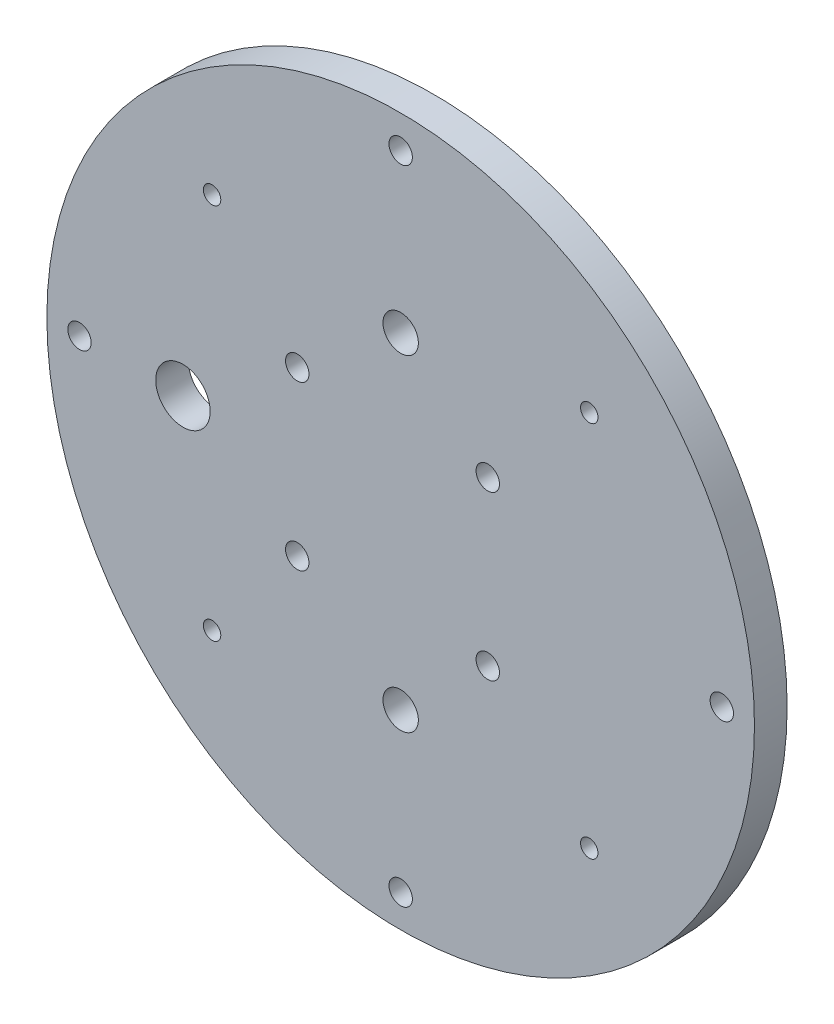
ISO-10303-21;
HEADER;
FILE_DESCRIPTION(('STEP AP214'),'2;1');
FILE_NAME('part.step','',(''),(''),'','','');
FILE_SCHEMA(('AUTOMOTIVE_DESIGN { 1 0 10303 214 1 1 1 1 }'));
ENDSEC;
DATA;
#1=APPLICATION_CONTEXT('core data for automotive mechanical design processes');
#2=APPLICATION_PROTOCOL_DEFINITION('international standard','automotive_design',2000,#1);
#3=PRODUCT_CONTEXT('',#1,'mechanical');
#4=PRODUCT('Part','Part','',(#3));
#5=PRODUCT_RELATED_PRODUCT_CATEGORY('part','',(#4));
#6=PRODUCT_DEFINITION_FORMATION('','',#4);
#7=PRODUCT_DEFINITION_CONTEXT('part definition',#1,'design');
#8=PRODUCT_DEFINITION('design','',#6,#7);
#9=PRODUCT_DEFINITION_SHAPE('','',#8);
#10=(LENGTH_UNIT() NAMED_UNIT(*) SI_UNIT(.MILLI.,.METRE.));
#11=(NAMED_UNIT(*) PLANE_ANGLE_UNIT() SI_UNIT($,.RADIAN.));
#12=(NAMED_UNIT(*) SI_UNIT($,.STERADIAN.) SOLID_ANGLE_UNIT());
#13=UNCERTAINTY_MEASURE_WITH_UNIT(LENGTH_MEASURE(1.E-05),#10,'distance_accuracy_value','');
#14=(GEOMETRIC_REPRESENTATION_CONTEXT(3) GLOBAL_UNCERTAINTY_ASSIGNED_CONTEXT((#13)) GLOBAL_UNIT_ASSIGNED_CONTEXT((#10,
#11,#12)) REPRESENTATION_CONTEXT('',''));
#15=CARTESIAN_POINT('',(0.,0.,0.));
#16=DIRECTION('',(0.,0.,1.));
#17=DIRECTION('',(1.,0.,0.));
#18=AXIS2_PLACEMENT_3D('',#15,#16,#17);
#19=CARTESIAN_POINT('',(0.,0.,6.));
#20=DIRECTION('',(0.,0.,1.));
#21=DIRECTION('',(1.,0.,0.));
#22=AXIS2_PLACEMENT_3D('',#19,#20,#21);
#23=PLANE('',#22);
#24=CARTESIAN_POINT('',(0.,-30.,6.));
#25=DIRECTION('',(0.,0.,1.));
#26=DIRECTION('',(1.,0.,0.));
#27=AXIS2_PLACEMENT_3D('',#24,#25,#26);
#28=CIRCLE('',#27,3.25);
#29=CARTESIAN_POINT('',(3.25,-30.,6.));
#30=VERTEX_POINT('',#29);
#31=EDGE_CURVE('E123',#30,#30,#28,.T.);
#32=ORIENTED_EDGE('',*,*,#31,.F.);
#33=EDGE_LOOP('',(#32));
#34=FACE_BOUND('',#33,.T.);
#35=CARTESIAN_POINT('',(16.,-15.,6.));
#36=DIRECTION('',(0.,0.,1.));
#37=DIRECTION('',(1.,0.,0.));
#38=AXIS2_PLACEMENT_3D('',#35,#36,#37);
#39=CIRCLE('',#38,2.15);
#40=CARTESIAN_POINT('',(18.15,-15.,6.));
#41=VERTEX_POINT('',#40);
#42=EDGE_CURVE('E111',#41,#41,#39,.T.);
#43=ORIENTED_EDGE('',*,*,#42,.F.);
#44=EDGE_LOOP('',(#43));
#45=FACE_BOUND('',#44,.T.);
#46=CARTESIAN_POINT('',(-19.,-15.,6.));
#47=DIRECTION('',(0.,0.,1.));
#48=DIRECTION('',(1.,0.,0.));
#49=AXIS2_PLACEMENT_3D('',#46,#47,#48);
#50=CIRCLE('',#49,2.15);
#51=CARTESIAN_POINT('',(-16.85,-15.,6.));
#52=VERTEX_POINT('',#51);
#53=EDGE_CURVE('E99',#52,#52,#50,.T.);
#54=ORIENTED_EDGE('',*,*,#53,.F.);
#55=EDGE_LOOP('',(#54));
#56=FACE_BOUND('',#55,.T.);
#57=CARTESIAN_POINT('',(0.,-59.,6.));
#58=DIRECTION('',(0.,0.,1.));
#59=DIRECTION('',(1.,0.,0.));
#60=AXIS2_PLACEMENT_3D('',#57,#58,#59);
#61=CIRCLE('',#60,2.15);
#62=CARTESIAN_POINT('',(2.14999999999999,-59.,6.));
#63=VERTEX_POINT('',#62);
#64=EDGE_CURVE('E87',#63,#63,#61,.T.);
#65=ORIENTED_EDGE('',*,*,#64,.F.);
#66=EDGE_LOOP('',(#65));
#67=FACE_BOUND('',#66,.T.);
#68=CARTESIAN_POINT('',(0.,59.,6.));
#69=DIRECTION('',(0.,0.,1.));
#70=DIRECTION('',(1.,0.,0.));
#71=AXIS2_PLACEMENT_3D('',#68,#69,#70);
#72=CIRCLE('',#71,2.15);
#73=CARTESIAN_POINT('',(2.15,59.,6.));
#74=VERTEX_POINT('',#73);
#75=EDGE_CURVE('E75',#74,#74,#72,.T.);
#76=ORIENTED_EDGE('',*,*,#75,.F.);
#77=EDGE_LOOP('',(#76));
#78=FACE_BOUND('',#77,.T.);
#79=CARTESIAN_POINT('',(34.6482322781408,-34.6482322781408,6.));
#80=DIRECTION('',(0.,0.,1.));
#81=DIRECTION('',(1.,0.,0.));
#82=AXIS2_PLACEMENT_3D('',#79,#80,#81);
#83=CIRCLE('',#82,1.6);
#84=CARTESIAN_POINT('',(36.2482322781408,-34.6482322781408,6.));
#85=VERTEX_POINT('',#84);
#86=EDGE_CURVE('E63',#85,#85,#83,.T.);
#87=ORIENTED_EDGE('',*,*,#86,.F.);
#88=EDGE_LOOP('',(#87));
#89=FACE_BOUND('',#88,.T.);
#90=CARTESIAN_POINT('',(-34.6482322781408,34.6482322781408,6.));
#91=DIRECTION('',(0.,0.,1.));
#92=DIRECTION('',(1.,0.,0.));
#93=AXIS2_PLACEMENT_3D('',#90,#91,#92);
#94=CIRCLE('',#93,1.6);
#95=CARTESIAN_POINT('',(-33.0482322781408,34.6482322781408,6.));
#96=VERTEX_POINT('',#95);
#97=EDGE_CURVE('E51',#96,#96,#94,.T.);
#98=ORIENTED_EDGE('',*,*,#97,.F.);
#99=EDGE_LOOP('',(#98));
#100=FACE_BOUND('',#99,.T.);
#101=CARTESIAN_POINT('',(0.,0.,6.));
#102=DIRECTION('',(0.,0.,1.));
#103=DIRECTION('',(1.,0.,0.));
#104=AXIS2_PLACEMENT_3D('',#101,#102,#103);
#105=CIRCLE('',#104,65.);
#106=CARTESIAN_POINT('',(65.,0.,6.));
#107=VERTEX_POINT('',#106);
#108=EDGE_CURVE('E10',#107,#107,#105,.T.);
#109=ORIENTED_EDGE('',*,*,#108,.T.);
#110=EDGE_LOOP('',(#109));
#111=FACE_BOUND('',#110,.T.);
#112=CARTESIAN_POINT('',(34.6482322781408,34.6482322781408,6.));
#113=DIRECTION('',(0.,0.,1.));
#114=DIRECTION('',(1.,0.,0.));
#115=AXIS2_PLACEMENT_3D('',#112,#113,#114);
#116=CIRCLE('',#115,1.6);
#117=CARTESIAN_POINT('',(36.2482322781408,34.6482322781408,6.));
#118=VERTEX_POINT('',#117);
#119=EDGE_CURVE('E46',#118,#118,#116,.T.);
#120=ORIENTED_EDGE('',*,*,#119,.F.);
#121=EDGE_LOOP('',(#120));
#122=FACE_BOUND('',#121,.T.);
#123=CARTESIAN_POINT('',(-34.6482322781408,-34.6482322781408,6.));
#124=DIRECTION('',(0.,0.,1.));
#125=DIRECTION('',(1.,0.,0.));
#126=AXIS2_PLACEMENT_3D('',#123,#124,#125);
#127=CIRCLE('',#126,1.6);
#128=CARTESIAN_POINT('',(-33.0482322781408,-34.6482322781408,6.));
#129=VERTEX_POINT('',#128);
#130=EDGE_CURVE('E57',#129,#129,#127,.T.);
#131=ORIENTED_EDGE('',*,*,#130,.F.);
#132=EDGE_LOOP('',(#131));
#133=FACE_BOUND('',#132,.T.);
#134=CARTESIAN_POINT('',(59.,0.,6.));
#135=DIRECTION('',(0.,0.,1.));
#136=DIRECTION('',(1.,0.,0.));
#137=AXIS2_PLACEMENT_3D('',#134,#135,#136);
#138=CIRCLE('',#137,2.15);
#139=CARTESIAN_POINT('',(61.15,0.,6.));
#140=VERTEX_POINT('',#139);
#141=EDGE_CURVE('E69',#140,#140,#138,.T.);
#142=ORIENTED_EDGE('',*,*,#141,.F.);
#143=EDGE_LOOP('',(#142));
#144=FACE_BOUND('',#143,.T.);
#145=CARTESIAN_POINT('',(-59.,0.,6.));
#146=DIRECTION('',(0.,0.,1.));
#147=DIRECTION('',(1.,0.,0.));
#148=AXIS2_PLACEMENT_3D('',#145,#146,#147);
#149=CIRCLE('',#148,2.15);
#150=CARTESIAN_POINT('',(-56.85,0.,6.));
#151=VERTEX_POINT('',#150);
#152=EDGE_CURVE('E81',#151,#151,#149,.T.);
#153=ORIENTED_EDGE('',*,*,#152,.F.);
#154=EDGE_LOOP('',(#153));
#155=FACE_BOUND('',#154,.T.);
#156=CARTESIAN_POINT('',(-19.,15.,6.));
#157=DIRECTION('',(0.,0.,1.));
#158=DIRECTION('',(1.,0.,0.));
#159=AXIS2_PLACEMENT_3D('',#156,#157,#158);
#160=CIRCLE('',#159,2.15);
#161=CARTESIAN_POINT('',(-16.85,15.,6.));
#162=VERTEX_POINT('',#161);
#163=EDGE_CURVE('E93',#162,#162,#160,.T.);
#164=ORIENTED_EDGE('',*,*,#163,.F.);
#165=EDGE_LOOP('',(#164));
#166=FACE_BOUND('',#165,.T.);
#167=CARTESIAN_POINT('',(16.,15.,6.));
#168=DIRECTION('',(0.,0.,1.));
#169=DIRECTION('',(1.,0.,0.));
#170=AXIS2_PLACEMENT_3D('',#167,#168,#169);
#171=CIRCLE('',#170,2.15);
#172=CARTESIAN_POINT('',(18.15,15.,6.));
#173=VERTEX_POINT('',#172);
#174=EDGE_CURVE('E105',#173,#173,#171,.T.);
#175=ORIENTED_EDGE('',*,*,#174,.F.);
#176=EDGE_LOOP('',(#175));
#177=FACE_BOUND('',#176,.T.);
#178=CARTESIAN_POINT('',(0.,30.,6.));
#179=DIRECTION('',(0.,0.,1.));
#180=DIRECTION('',(1.,0.,0.));
#181=AXIS2_PLACEMENT_3D('',#178,#179,#180);
#182=CIRCLE('',#181,3.25);
#183=CARTESIAN_POINT('',(3.25,30.,6.));
#184=VERTEX_POINT('',#183);
#185=EDGE_CURVE('E117',#184,#184,#182,.T.);
#186=ORIENTED_EDGE('',*,*,#185,.F.);
#187=EDGE_LOOP('',(#186));
#188=FACE_BOUND('',#187,.T.);
#189=CARTESIAN_POINT('',(-40.,0.,6.));
#190=DIRECTION('',(0.,0.,1.));
#191=DIRECTION('',(1.,0.,0.));
#192=AXIS2_PLACEMENT_3D('',#189,#190,#191);
#193=CIRCLE('',#192,5.);
#194=CARTESIAN_POINT('',(-35.,0.,6.));
#195=VERTEX_POINT('',#194);
#196=EDGE_CURVE('E129',#195,#195,#193,.T.);
#197=ORIENTED_EDGE('',*,*,#196,.F.);
#198=EDGE_LOOP('',(#197));
#199=FACE_BOUND('',#198,.T.);
#200=ADVANCED_FACE('F35',(#34,#45,#56,#67,#78,#89,#100,#111,#122,#133,#144,#155,#166,#177,#188,
#199),#23,.T.);
#201=CARTESIAN_POINT('',(0.,0.,0.));
#202=DIRECTION('',(0.,0.,1.));
#203=DIRECTION('',(1.,0.,0.));
#204=AXIS2_PLACEMENT_3D('',#201,#202,#203);
#205=PLANE('',#204);
#206=CARTESIAN_POINT('',(0.,0.,0.));
#207=DIRECTION('',(0.,0.,1.));
#208=DIRECTION('',(1.,0.,0.));
#209=AXIS2_PLACEMENT_3D('',#206,#207,#208);
#210=CIRCLE('',#209,65.);
#211=CARTESIAN_POINT('',(65.,0.,0.));
#212=VERTEX_POINT('',#211);
#213=EDGE_CURVE('E39',#212,#212,#210,.T.);
#214=ORIENTED_EDGE('',*,*,#213,.F.);
#215=EDGE_LOOP('',(#214));
#216=FACE_BOUND('',#215,.T.);
#217=CARTESIAN_POINT('',(34.6482322781408,34.6482322781408,0.));
#218=DIRECTION('',(0.,0.,1.));
#219=DIRECTION('',(1.,0.,0.));
#220=AXIS2_PLACEMENT_3D('',#217,#218,#219);
#221=CIRCLE('',#220,1.6);
#222=CARTESIAN_POINT('',(36.2482322781408,34.6482322781408,0.));
#223=VERTEX_POINT('',#222);
#224=EDGE_CURVE('E48',#223,#223,#221,.T.);
#225=ORIENTED_EDGE('',*,*,#224,.T.);
#226=EDGE_LOOP('',(#225));
#227=FACE_BOUND('',#226,.T.);
#228=CARTESIAN_POINT('',(-34.6482322781408,34.6482322781408,0.));
#229=DIRECTION('',(0.,0.,1.));
#230=DIRECTION('',(1.,0.,0.));
#231=AXIS2_PLACEMENT_3D('',#228,#229,#230);
#232=CIRCLE('',#231,1.6);
#233=CARTESIAN_POINT('',(-33.0482322781408,34.6482322781408,0.));
#234=VERTEX_POINT('',#233);
#235=EDGE_CURVE('E54',#234,#234,#232,.T.);
#236=ORIENTED_EDGE('',*,*,#235,.T.);
#237=EDGE_LOOP('',(#236));
#238=FACE_BOUND('',#237,.T.);
#239=CARTESIAN_POINT('',(-34.6482322781408,-34.6482322781408,0.));
#240=DIRECTION('',(0.,0.,1.));
#241=DIRECTION('',(1.,0.,0.));
#242=AXIS2_PLACEMENT_3D('',#239,#240,#241);
#243=CIRCLE('',#242,1.6);
#244=CARTESIAN_POINT('',(-33.0482322781408,-34.6482322781408,0.));
#245=VERTEX_POINT('',#244);
#246=EDGE_CURVE('E60',#245,#245,#243,.T.);
#247=ORIENTED_EDGE('',*,*,#246,.T.);
#248=EDGE_LOOP('',(#247));
#249=FACE_BOUND('',#248,.T.);
#250=CARTESIAN_POINT('',(34.6482322781408,-34.6482322781408,0.));
#251=DIRECTION('',(0.,0.,1.));
#252=DIRECTION('',(1.,0.,0.));
#253=AXIS2_PLACEMENT_3D('',#250,#251,#252);
#254=CIRCLE('',#253,1.6);
#255=CARTESIAN_POINT('',(36.2482322781408,-34.6482322781408,0.));
#256=VERTEX_POINT('',#255);
#257=EDGE_CURVE('E66',#256,#256,#254,.T.);
#258=ORIENTED_EDGE('',*,*,#257,.T.);
#259=EDGE_LOOP('',(#258));
#260=FACE_BOUND('',#259,.T.);
#261=CARTESIAN_POINT('',(59.,0.,0.));
#262=DIRECTION('',(0.,0.,1.));
#263=DIRECTION('',(1.,0.,0.));
#264=AXIS2_PLACEMENT_3D('',#261,#262,#263);
#265=CIRCLE('',#264,2.15);
#266=CARTESIAN_POINT('',(61.15,0.,0.));
#267=VERTEX_POINT('',#266);
#268=EDGE_CURVE('E72',#267,#267,#265,.T.);
#269=ORIENTED_EDGE('',*,*,#268,.T.);
#270=EDGE_LOOP('',(#269));
#271=FACE_BOUND('',#270,.T.);
#272=CARTESIAN_POINT('',(0.,59.,0.));
#273=DIRECTION('',(0.,0.,1.));
#274=DIRECTION('',(1.,0.,0.));
#275=AXIS2_PLACEMENT_3D('',#272,#273,#274);
#276=CIRCLE('',#275,2.15);
#277=CARTESIAN_POINT('',(2.15,59.,0.));
#278=VERTEX_POINT('',#277);
#279=EDGE_CURVE('E78',#278,#278,#276,.T.);
#280=ORIENTED_EDGE('',*,*,#279,.T.);
#281=EDGE_LOOP('',(#280));
#282=FACE_BOUND('',#281,.T.);
#283=CARTESIAN_POINT('',(-59.,0.,0.));
#284=DIRECTION('',(0.,0.,1.));
#285=DIRECTION('',(1.,0.,0.));
#286=AXIS2_PLACEMENT_3D('',#283,#284,#285);
#287=CIRCLE('',#286,2.15);
#288=CARTESIAN_POINT('',(-56.85,0.,0.));
#289=VERTEX_POINT('',#288);
#290=EDGE_CURVE('E84',#289,#289,#287,.T.);
#291=ORIENTED_EDGE('',*,*,#290,.T.);
#292=EDGE_LOOP('',(#291));
#293=FACE_BOUND('',#292,.T.);
#294=CARTESIAN_POINT('',(0.,-59.,0.));
#295=DIRECTION('',(0.,0.,1.));
#296=DIRECTION('',(1.,0.,0.));
#297=AXIS2_PLACEMENT_3D('',#294,#295,#296);
#298=CIRCLE('',#297,2.15);
#299=CARTESIAN_POINT('',(2.14999999999999,-59.,0.));
#300=VERTEX_POINT('',#299);
#301=EDGE_CURVE('E90',#300,#300,#298,.T.);
#302=ORIENTED_EDGE('',*,*,#301,.T.);
#303=EDGE_LOOP('',(#302));
#304=FACE_BOUND('',#303,.T.);
#305=CARTESIAN_POINT('',(-19.,15.,0.));
#306=DIRECTION('',(0.,0.,1.));
#307=DIRECTION('',(1.,0.,0.));
#308=AXIS2_PLACEMENT_3D('',#305,#306,#307);
#309=CIRCLE('',#308,2.15);
#310=CARTESIAN_POINT('',(-16.85,15.,0.));
#311=VERTEX_POINT('',#310);
#312=EDGE_CURVE('E96',#311,#311,#309,.T.);
#313=ORIENTED_EDGE('',*,*,#312,.T.);
#314=EDGE_LOOP('',(#313));
#315=FACE_BOUND('',#314,.T.);
#316=CARTESIAN_POINT('',(-19.,-15.,0.));
#317=DIRECTION('',(0.,0.,1.));
#318=DIRECTION('',(1.,0.,0.));
#319=AXIS2_PLACEMENT_3D('',#316,#317,#318);
#320=CIRCLE('',#319,2.15);
#321=CARTESIAN_POINT('',(-16.85,-15.,0.));
#322=VERTEX_POINT('',#321);
#323=EDGE_CURVE('E102',#322,#322,#320,.T.);
#324=ORIENTED_EDGE('',*,*,#323,.T.);
#325=EDGE_LOOP('',(#324));
#326=FACE_BOUND('',#325,.T.);
#327=CARTESIAN_POINT('',(16.,15.,0.));
#328=DIRECTION('',(0.,0.,1.));
#329=DIRECTION('',(1.,0.,0.));
#330=AXIS2_PLACEMENT_3D('',#327,#328,#329);
#331=CIRCLE('',#330,2.15);
#332=CARTESIAN_POINT('',(18.15,15.,0.));
#333=VERTEX_POINT('',#332);
#334=EDGE_CURVE('E108',#333,#333,#331,.T.);
#335=ORIENTED_EDGE('',*,*,#334,.T.);
#336=EDGE_LOOP('',(#335));
#337=FACE_BOUND('',#336,.T.);
#338=CARTESIAN_POINT('',(16.,-15.,0.));
#339=DIRECTION('',(0.,0.,1.));
#340=DIRECTION('',(1.,0.,0.));
#341=AXIS2_PLACEMENT_3D('',#338,#339,#340);
#342=CIRCLE('',#341,2.15);
#343=CARTESIAN_POINT('',(18.15,-15.,0.));
#344=VERTEX_POINT('',#343);
#345=EDGE_CURVE('E114',#344,#344,#342,.T.);
#346=ORIENTED_EDGE('',*,*,#345,.T.);
#347=EDGE_LOOP('',(#346));
#348=FACE_BOUND('',#347,.T.);
#349=CARTESIAN_POINT('',(0.,30.,0.));
#350=DIRECTION('',(0.,0.,1.));
#351=DIRECTION('',(1.,0.,0.));
#352=AXIS2_PLACEMENT_3D('',#349,#350,#351);
#353=CIRCLE('',#352,3.25);
#354=CARTESIAN_POINT('',(3.25,30.,0.));
#355=VERTEX_POINT('',#354);
#356=EDGE_CURVE('E120',#355,#355,#353,.T.);
#357=ORIENTED_EDGE('',*,*,#356,.T.);
#358=EDGE_LOOP('',(#357));
#359=FACE_BOUND('',#358,.T.);
#360=CARTESIAN_POINT('',(0.,-30.,0.));
#361=DIRECTION('',(0.,0.,1.));
#362=DIRECTION('',(1.,0.,0.));
#363=AXIS2_PLACEMENT_3D('',#360,#361,#362);
#364=CIRCLE('',#363,3.25);
#365=CARTESIAN_POINT('',(3.25,-30.,0.));
#366=VERTEX_POINT('',#365);
#367=EDGE_CURVE('E126',#366,#366,#364,.T.);
#368=ORIENTED_EDGE('',*,*,#367,.T.);
#369=EDGE_LOOP('',(#368));
#370=FACE_BOUND('',#369,.T.);
#371=CARTESIAN_POINT('',(-40.,0.,0.));
#372=DIRECTION('',(0.,0.,1.));
#373=DIRECTION('',(1.,0.,0.));
#374=AXIS2_PLACEMENT_3D('',#371,#372,#373);
#375=CIRCLE('',#374,5.);
#376=CARTESIAN_POINT('',(-35.,0.,0.));
#377=VERTEX_POINT('',#376);
#378=EDGE_CURVE('E132',#377,#377,#375,.T.);
#379=ORIENTED_EDGE('',*,*,#378,.T.);
#380=EDGE_LOOP('',(#379));
#381=FACE_BOUND('',#380,.T.);
#382=ADVANCED_FACE('F142',(#216,#227,#238,#249,#260,#271,#282,#293,#304,#315,#326,#337,#348,
#359,#370,#381),#205,.F.);
#383=CARTESIAN_POINT('',(0.,0.,6.));
#384=DIRECTION('',(0.,0.,-1.));
#385=DIRECTION('',(-1.,0.,0.));
#386=AXIS2_PLACEMENT_3D('',#383,#384,#385);
#387=CYLINDRICAL_SURFACE('',#386,65.);
#388=ORIENTED_EDGE('',*,*,#108,.F.);
#389=EDGE_LOOP('',(#388));
#390=FACE_BOUND('',#389,.T.);
#391=ORIENTED_EDGE('',*,*,#213,.T.);
#392=EDGE_LOOP('',(#391));
#393=FACE_BOUND('',#392,.T.);
#394=ADVANCED_FACE('F37',(#390,#393),#387,.T.);
#395=CARTESIAN_POINT('',(34.6482322781408,34.6482322781408,6.));
#396=DIRECTION('',(0.,0.,-1.));
#397=DIRECTION('',(-1.,0.,0.));
#398=AXIS2_PLACEMENT_3D('',#395,#396,#397);
#399=CYLINDRICAL_SURFACE('',#398,1.6);
#400=ORIENTED_EDGE('',*,*,#119,.T.);
#401=EDGE_LOOP('',(#400));
#402=FACE_BOUND('',#401,.T.);
#403=ORIENTED_EDGE('',*,*,#224,.F.);
#404=EDGE_LOOP('',(#403));
#405=FACE_BOUND('',#404,.T.);
#406=ADVANCED_FACE('F152',(#402,#405),#399,.F.);
#407=CARTESIAN_POINT('',(-34.6482322781408,34.6482322781408,6.));
#408=DIRECTION('',(0.,0.,-1.));
#409=DIRECTION('',(-1.,0.,0.));
#410=AXIS2_PLACEMENT_3D('',#407,#408,#409);
#411=CYLINDRICAL_SURFACE('',#410,1.6);
#412=ORIENTED_EDGE('',*,*,#97,.T.);
#413=EDGE_LOOP('',(#412));
#414=FACE_BOUND('',#413,.T.);
#415=ORIENTED_EDGE('',*,*,#235,.F.);
#416=EDGE_LOOP('',(#415));
#417=FACE_BOUND('',#416,.T.);
#418=ADVANCED_FACE('F155',(#414,#417),#411,.F.);
#419=CARTESIAN_POINT('',(-34.6482322781408,-34.6482322781408,6.));
#420=DIRECTION('',(0.,0.,-1.));
#421=DIRECTION('',(-1.,0.,0.));
#422=AXIS2_PLACEMENT_3D('',#419,#420,#421);
#423=CYLINDRICAL_SURFACE('',#422,1.6);
#424=ORIENTED_EDGE('',*,*,#130,.T.);
#425=EDGE_LOOP('',(#424));
#426=FACE_BOUND('',#425,.T.);
#427=ORIENTED_EDGE('',*,*,#246,.F.);
#428=EDGE_LOOP('',(#427));
#429=FACE_BOUND('',#428,.T.);
#430=ADVANCED_FACE('F159',(#426,#429),#423,.F.);
#431=CARTESIAN_POINT('',(34.6482322781408,-34.6482322781408,6.));
#432=DIRECTION('',(0.,0.,-1.));
#433=DIRECTION('',(-1.,0.,0.));
#434=AXIS2_PLACEMENT_3D('',#431,#432,#433);
#435=CYLINDRICAL_SURFACE('',#434,1.6);
#436=ORIENTED_EDGE('',*,*,#86,.T.);
#437=EDGE_LOOP('',(#436));
#438=FACE_BOUND('',#437,.T.);
#439=ORIENTED_EDGE('',*,*,#257,.F.);
#440=EDGE_LOOP('',(#439));
#441=FACE_BOUND('',#440,.T.);
#442=ADVANCED_FACE('F163',(#438,#441),#435,.F.);
#443=CARTESIAN_POINT('',(59.,0.,6.));
#444=DIRECTION('',(0.,0.,-1.));
#445=DIRECTION('',(-1.,0.,0.));
#446=AXIS2_PLACEMENT_3D('',#443,#444,#445);
#447=CYLINDRICAL_SURFACE('',#446,2.15);
#448=ORIENTED_EDGE('',*,*,#141,.T.);
#449=EDGE_LOOP('',(#448));
#450=FACE_BOUND('',#449,.T.);
#451=ORIENTED_EDGE('',*,*,#268,.F.);
#452=EDGE_LOOP('',(#451));
#453=FACE_BOUND('',#452,.T.);
#454=ADVANCED_FACE('F167',(#450,#453),#447,.F.);
#455=CARTESIAN_POINT('',(0.,59.,6.));
#456=DIRECTION('',(0.,0.,-1.));
#457=DIRECTION('',(-1.,0.,0.));
#458=AXIS2_PLACEMENT_3D('',#455,#456,#457);
#459=CYLINDRICAL_SURFACE('',#458,2.15);
#460=ORIENTED_EDGE('',*,*,#75,.T.);
#461=EDGE_LOOP('',(#460));
#462=FACE_BOUND('',#461,.T.);
#463=ORIENTED_EDGE('',*,*,#279,.F.);
#464=EDGE_LOOP('',(#463));
#465=FACE_BOUND('',#464,.T.);
#466=ADVANCED_FACE('F171',(#462,#465),#459,.F.);
#467=CARTESIAN_POINT('',(-59.,0.,6.));
#468=DIRECTION('',(0.,0.,-1.));
#469=DIRECTION('',(-1.,0.,0.));
#470=AXIS2_PLACEMENT_3D('',#467,#468,#469);
#471=CYLINDRICAL_SURFACE('',#470,2.15);
#472=ORIENTED_EDGE('',*,*,#152,.T.);
#473=EDGE_LOOP('',(#472));
#474=FACE_BOUND('',#473,.T.);
#475=ORIENTED_EDGE('',*,*,#290,.F.);
#476=EDGE_LOOP('',(#475));
#477=FACE_BOUND('',#476,.T.);
#478=ADVANCED_FACE('F175',(#474,#477),#471,.F.);
#479=CARTESIAN_POINT('',(0.,-59.,6.));
#480=DIRECTION('',(0.,0.,-1.));
#481=DIRECTION('',(-1.,0.,0.));
#482=AXIS2_PLACEMENT_3D('',#479,#480,#481);
#483=CYLINDRICAL_SURFACE('',#482,2.15);
#484=ORIENTED_EDGE('',*,*,#64,.T.);
#485=EDGE_LOOP('',(#484));
#486=FACE_BOUND('',#485,.T.);
#487=ORIENTED_EDGE('',*,*,#301,.F.);
#488=EDGE_LOOP('',(#487));
#489=FACE_BOUND('',#488,.T.);
#490=ADVANCED_FACE('F179',(#486,#489),#483,.F.);
#491=CARTESIAN_POINT('',(-19.,15.,6.));
#492=DIRECTION('',(0.,0.,-1.));
#493=DIRECTION('',(-1.,0.,0.));
#494=AXIS2_PLACEMENT_3D('',#491,#492,#493);
#495=CYLINDRICAL_SURFACE('',#494,2.15);
#496=ORIENTED_EDGE('',*,*,#163,.T.);
#497=EDGE_LOOP('',(#496));
#498=FACE_BOUND('',#497,.T.);
#499=ORIENTED_EDGE('',*,*,#312,.F.);
#500=EDGE_LOOP('',(#499));
#501=FACE_BOUND('',#500,.T.);
#502=ADVANCED_FACE('F183',(#498,#501),#495,.F.);
#503=CARTESIAN_POINT('',(-19.,-15.,6.));
#504=DIRECTION('',(0.,0.,-1.));
#505=DIRECTION('',(-1.,0.,0.));
#506=AXIS2_PLACEMENT_3D('',#503,#504,#505);
#507=CYLINDRICAL_SURFACE('',#506,2.15);
#508=ORIENTED_EDGE('',*,*,#53,.T.);
#509=EDGE_LOOP('',(#508));
#510=FACE_BOUND('',#509,.T.);
#511=ORIENTED_EDGE('',*,*,#323,.F.);
#512=EDGE_LOOP('',(#511));
#513=FACE_BOUND('',#512,.T.);
#514=ADVANCED_FACE('F187',(#510,#513),#507,.F.);
#515=CARTESIAN_POINT('',(16.,15.,6.));
#516=DIRECTION('',(0.,0.,-1.));
#517=DIRECTION('',(-1.,0.,0.));
#518=AXIS2_PLACEMENT_3D('',#515,#516,#517);
#519=CYLINDRICAL_SURFACE('',#518,2.15);
#520=ORIENTED_EDGE('',*,*,#174,.T.);
#521=EDGE_LOOP('',(#520));
#522=FACE_BOUND('',#521,.T.);
#523=ORIENTED_EDGE('',*,*,#334,.F.);
#524=EDGE_LOOP('',(#523));
#525=FACE_BOUND('',#524,.T.);
#526=ADVANCED_FACE('F191',(#522,#525),#519,.F.);
#527=CARTESIAN_POINT('',(16.,-15.,6.));
#528=DIRECTION('',(0.,0.,-1.));
#529=DIRECTION('',(-1.,0.,0.));
#530=AXIS2_PLACEMENT_3D('',#527,#528,#529);
#531=CYLINDRICAL_SURFACE('',#530,2.15);
#532=ORIENTED_EDGE('',*,*,#42,.T.);
#533=EDGE_LOOP('',(#532));
#534=FACE_BOUND('',#533,.T.);
#535=ORIENTED_EDGE('',*,*,#345,.F.);
#536=EDGE_LOOP('',(#535));
#537=FACE_BOUND('',#536,.T.);
#538=ADVANCED_FACE('F195',(#534,#537),#531,.F.);
#539=CARTESIAN_POINT('',(0.,30.,6.));
#540=DIRECTION('',(0.,0.,-1.));
#541=DIRECTION('',(-1.,0.,0.));
#542=AXIS2_PLACEMENT_3D('',#539,#540,#541);
#543=CYLINDRICAL_SURFACE('',#542,3.25);
#544=ORIENTED_EDGE('',*,*,#185,.T.);
#545=EDGE_LOOP('',(#544));
#546=FACE_BOUND('',#545,.T.);
#547=ORIENTED_EDGE('',*,*,#356,.F.);
#548=EDGE_LOOP('',(#547));
#549=FACE_BOUND('',#548,.T.);
#550=ADVANCED_FACE('F199',(#546,#549),#543,.F.);
#551=CARTESIAN_POINT('',(0.,-30.,6.));
#552=DIRECTION('',(0.,0.,-1.));
#553=DIRECTION('',(-1.,0.,0.));
#554=AXIS2_PLACEMENT_3D('',#551,#552,#553);
#555=CYLINDRICAL_SURFACE('',#554,3.25);
#556=ORIENTED_EDGE('',*,*,#31,.T.);
#557=EDGE_LOOP('',(#556));
#558=FACE_BOUND('',#557,.T.);
#559=ORIENTED_EDGE('',*,*,#367,.F.);
#560=EDGE_LOOP('',(#559));
#561=FACE_BOUND('',#560,.T.);
#562=ADVANCED_FACE('F203',(#558,#561),#555,.F.);
#563=CARTESIAN_POINT('',(-40.,0.,6.));
#564=DIRECTION('',(0.,0.,-1.));
#565=DIRECTION('',(-1.,0.,0.));
#566=AXIS2_PLACEMENT_3D('',#563,#564,#565);
#567=CYLINDRICAL_SURFACE('',#566,5.);
#568=ORIENTED_EDGE('',*,*,#196,.T.);
#569=EDGE_LOOP('',(#568));
#570=FACE_BOUND('',#569,.T.);
#571=ORIENTED_EDGE('',*,*,#378,.F.);
#572=EDGE_LOOP('',(#571));
#573=FACE_BOUND('',#572,.T.);
#574=ADVANCED_FACE('F138',(#570,#573),#567,.F.);
#575=CLOSED_SHELL('',(#200,#382,#394,#406,#418,#430,#442,#454,#466,#478,#490,#502,#514,#526,
#538,#550,#562,#574));
#576=MANIFOLD_SOLID_BREP('B2',#575);
#577=ADVANCED_BREP_SHAPE_REPRESENTATION('',(#18,#576),#14);
#578=SHAPE_DEFINITION_REPRESENTATION(#9,#577);
ENDSEC;
END-ISO-10303-21;
